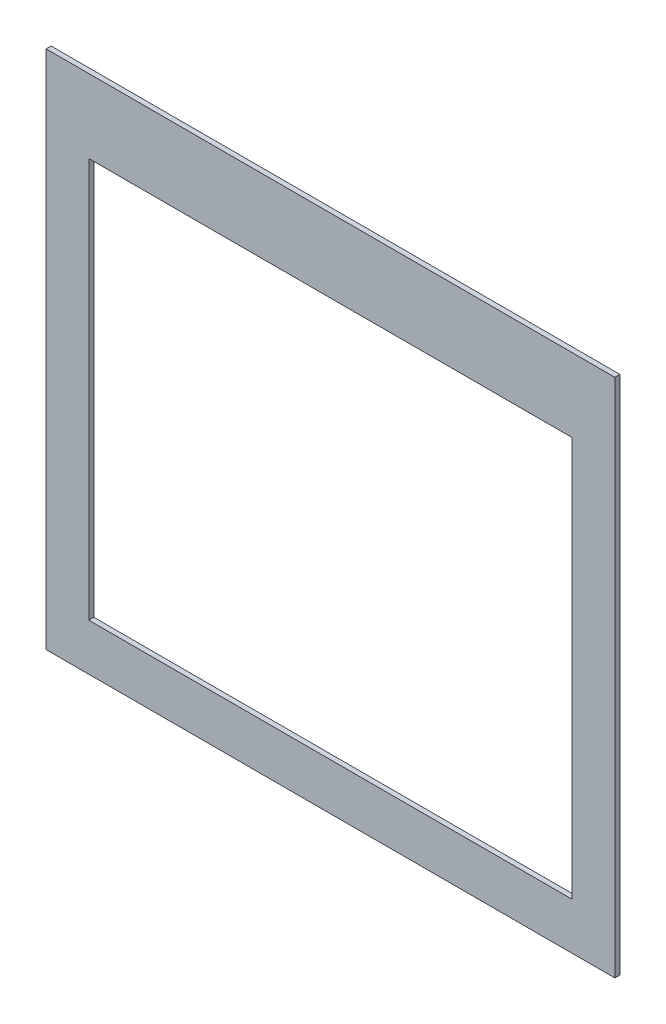
ISO-10303-21;
HEADER;
FILE_DESCRIPTION(('STEP AP214'),'2;1');
FILE_NAME('part.step','',(''),(''),'','','');
FILE_SCHEMA(('AUTOMOTIVE_DESIGN { 1 0 10303 214 1 1 1 1 }'));
ENDSEC;
DATA;
#1=APPLICATION_CONTEXT('core data for automotive mechanical design processes');
#2=APPLICATION_PROTOCOL_DEFINITION('international standard','automotive_design',2000,#1);
#3=PRODUCT_CONTEXT('',#1,'mechanical');
#4=PRODUCT('Part','Part','',(#3));
#5=PRODUCT_RELATED_PRODUCT_CATEGORY('part','',(#4));
#6=PRODUCT_DEFINITION_FORMATION('','',#4);
#7=PRODUCT_DEFINITION_CONTEXT('part definition',#1,'design');
#8=PRODUCT_DEFINITION('design','',#6,#7);
#9=PRODUCT_DEFINITION_SHAPE('','',#8);
#10=(LENGTH_UNIT() NAMED_UNIT(*) SI_UNIT(.MILLI.,.METRE.));
#11=(NAMED_UNIT(*) PLANE_ANGLE_UNIT() SI_UNIT($,.RADIAN.));
#12=(NAMED_UNIT(*) SI_UNIT($,.STERADIAN.) SOLID_ANGLE_UNIT());
#13=UNCERTAINTY_MEASURE_WITH_UNIT(LENGTH_MEASURE(1.E-05),#10,'distance_accuracy_value','');
#14=(GEOMETRIC_REPRESENTATION_CONTEXT(3) GLOBAL_UNCERTAINTY_ASSIGNED_CONTEXT((#13)) GLOBAL_UNIT_ASSIGNED_CONTEXT((#10,
#11,#12)) REPRESENTATION_CONTEXT('',''));
#15=CARTESIAN_POINT('',(0.,0.,0.));
#16=DIRECTION('',(0.,0.,1.));
#17=DIRECTION('',(1.,0.,0.));
#18=AXIS2_PLACEMENT_3D('',#15,#16,#17);
#19=CARTESIAN_POINT('',(0.,0.,3.));
#20=DIRECTION('',(0.,0.,1.));
#21=DIRECTION('',(1.,0.,0.));
#22=AXIS2_PLACEMENT_3D('',#19,#20,#21);
#23=PLANE('',#22);
#24=DIRECTION('',(0.,-1.,0.));
#25=VECTOR('',#24,1.);
#26=CARTESIAN_POINT('',(-170.,-155.5,3.));
#27=LINE('',#26,#25);
#28=CARTESIAN_POINT('',(-170.,155.5,3.));
#29=VERTEX_POINT('',#28);
#30=CARTESIAN_POINT('',(-170.,-155.5,3.));
#31=VERTEX_POINT('',#30);
#32=EDGE_CURVE('E134',#29,#31,#27,.T.);
#33=ORIENTED_EDGE('',*,*,#32,.T.);
#34=DIRECTION('',(1.,0.,0.));
#35=VECTOR('',#34,1.);
#36=CARTESIAN_POINT('',(170.,-155.5,3.));
#37=LINE('',#36,#35);
#38=CARTESIAN_POINT('',(170.,-155.5,3.));
#39=VERTEX_POINT('',#38);
#40=EDGE_CURVE('E137',#31,#39,#37,.T.);
#41=ORIENTED_EDGE('',*,*,#40,.T.);
#42=DIRECTION('',(0.,1.,0.));
#43=VECTOR('',#42,1.);
#44=CARTESIAN_POINT('',(170.,-155.5,3.));
#45=LINE('',#44,#43);
#46=CARTESIAN_POINT('',(170.,155.5,3.));
#47=VERTEX_POINT('',#46);
#48=EDGE_CURVE('E140',#39,#47,#45,.T.);
#49=ORIENTED_EDGE('',*,*,#48,.T.);
#50=DIRECTION('',(-1.,0.,0.));
#51=VECTOR('',#50,1.);
#52=CARTESIAN_POINT('',(170.,155.5,3.));
#53=LINE('',#52,#51);
#54=EDGE_CURVE('E142',#47,#29,#53,.T.);
#55=ORIENTED_EDGE('',*,*,#54,.T.);
#56=EDGE_LOOP('',(#33,#41,#49,#55));
#57=FACE_BOUND('',#56,.T.);
#58=DIRECTION('',(1.,0.,0.));
#59=VECTOR('',#58,1.);
#60=CARTESIAN_POINT('',(144.5,-127.5,3.));
#61=LINE('',#60,#59);
#62=CARTESIAN_POINT('',(-144.5,-127.5,3.));
#63=VERTEX_POINT('',#62);
#64=CARTESIAN_POINT('',(144.5,-127.5,3.));
#65=VERTEX_POINT('',#64);
#66=EDGE_CURVE('E106',#63,#65,#61,.T.);
#67=ORIENTED_EDGE('',*,*,#66,.F.);
#68=DIRECTION('',(0.,-1.,0.));
#69=VECTOR('',#68,1.);
#70=CARTESIAN_POINT('',(-144.5,-127.5,3.));
#71=LINE('',#70,#69);
#72=CARTESIAN_POINT('',(-144.5,111.5,3.));
#73=VERTEX_POINT('',#72);
#74=EDGE_CURVE('E98',#73,#63,#71,.T.);
#75=ORIENTED_EDGE('',*,*,#74,.F.);
#76=DIRECTION('',(-1.,0.,0.));
#77=VECTOR('',#76,1.);
#78=CARTESIAN_POINT('',(144.5,111.5,3.));
#79=LINE('',#78,#77);
#80=CARTESIAN_POINT('',(144.5,111.5,3.));
#81=VERTEX_POINT('',#80);
#82=EDGE_CURVE('E120',#81,#73,#79,.T.);
#83=ORIENTED_EDGE('',*,*,#82,.F.);
#84=DIRECTION('',(0.,1.,0.));
#85=VECTOR('',#84,1.);
#86=CARTESIAN_POINT('',(144.5,-127.5,3.));
#87=LINE('',#86,#85);
#88=EDGE_CURVE('E118',#65,#81,#87,.T.);
#89=ORIENTED_EDGE('',*,*,#88,.F.);
#90=EDGE_LOOP('',(#67,#75,#83,#89));
#91=FACE_BOUND('',#90,.T.);
#92=ADVANCED_FACE('F33',(#57,#91),#23,.T.);
#93=CARTESIAN_POINT('',(0.,0.,0.));
#94=DIRECTION('',(0.,0.,1.));
#95=DIRECTION('',(1.,0.,0.));
#96=AXIS2_PLACEMENT_3D('',#93,#94,#95);
#97=PLANE('',#96);
#98=DIRECTION('',(0.,-1.,0.));
#99=VECTOR('',#98,1.);
#100=CARTESIAN_POINT('',(-170.,-155.5,0.));
#101=LINE('',#100,#99);
#102=CARTESIAN_POINT('',(-170.,155.5,0.));
#103=VERTEX_POINT('',#102);
#104=CARTESIAN_POINT('',(-170.,-155.5,0.));
#105=VERTEX_POINT('',#104);
#106=EDGE_CURVE('E114',#103,#105,#101,.T.);
#107=ORIENTED_EDGE('',*,*,#106,.F.);
#108=DIRECTION('',(-1.,0.,0.));
#109=VECTOR('',#108,1.);
#110=CARTESIAN_POINT('',(170.,155.5,0.));
#111=LINE('',#110,#109);
#112=CARTESIAN_POINT('',(170.,155.5,0.));
#113=VERTEX_POINT('',#112);
#114=EDGE_CURVE('E138',#113,#103,#111,.T.);
#115=ORIENTED_EDGE('',*,*,#114,.F.);
#116=DIRECTION('',(0.,1.,0.));
#117=VECTOR('',#116,1.);
#118=CARTESIAN_POINT('',(170.,-155.5,0.));
#119=LINE('',#118,#117);
#120=CARTESIAN_POINT('',(170.,-155.5,0.));
#121=VERTEX_POINT('',#120);
#122=EDGE_CURVE('E149',#121,#113,#119,.T.);
#123=ORIENTED_EDGE('',*,*,#122,.F.);
#124=DIRECTION('',(1.,0.,0.));
#125=VECTOR('',#124,1.);
#126=CARTESIAN_POINT('',(170.,-155.5,0.));
#127=LINE('',#126,#125);
#128=EDGE_CURVE('E147',#105,#121,#127,.T.);
#129=ORIENTED_EDGE('',*,*,#128,.F.);
#130=EDGE_LOOP('',(#107,#115,#123,#129));
#131=FACE_BOUND('',#130,.T.);
#132=DIRECTION('',(0.,-1.,0.));
#133=VECTOR('',#132,1.);
#134=CARTESIAN_POINT('',(-144.5,-127.5,0.));
#135=LINE('',#134,#133);
#136=CARTESIAN_POINT('',(-144.5,111.5,0.));
#137=VERTEX_POINT('',#136);
#138=CARTESIAN_POINT('',(-144.5,-127.5,0.));
#139=VERTEX_POINT('',#138);
#140=EDGE_CURVE('E56',#137,#139,#135,.T.);
#141=ORIENTED_EDGE('',*,*,#140,.T.);
#142=DIRECTION('',(1.,0.,0.));
#143=VECTOR('',#142,1.);
#144=CARTESIAN_POINT('',(144.5,-127.5,0.));
#145=LINE('',#144,#143);
#146=CARTESIAN_POINT('',(144.5,-127.5,0.));
#147=VERTEX_POINT('',#146);
#148=EDGE_CURVE('E113',#139,#147,#145,.T.);
#149=ORIENTED_EDGE('',*,*,#148,.T.);
#150=DIRECTION('',(0.,1.,0.));
#151=VECTOR('',#150,1.);
#152=CARTESIAN_POINT('',(144.5,-127.5,0.));
#153=LINE('',#152,#151);
#154=CARTESIAN_POINT('',(144.5,111.5,0.));
#155=VERTEX_POINT('',#154);
#156=EDGE_CURVE('E126',#147,#155,#153,.T.);
#157=ORIENTED_EDGE('',*,*,#156,.T.);
#158=DIRECTION('',(-1.,0.,0.));
#159=VECTOR('',#158,1.);
#160=CARTESIAN_POINT('',(144.5,111.5,0.));
#161=LINE('',#160,#159);
#162=EDGE_CURVE('E107',#155,#137,#161,.T.);
#163=ORIENTED_EDGE('',*,*,#162,.T.);
#164=EDGE_LOOP('',(#141,#149,#157,#163));
#165=FACE_BOUND('',#164,.T.);
#166=ADVANCED_FACE('F167',(#131,#165),#97,.F.);
#167=CARTESIAN_POINT('',(-170.,-155.5,3.));
#168=DIRECTION('',(1.,0.,0.));
#169=DIRECTION('',(0.,0.,-1.));
#170=AXIS2_PLACEMENT_3D('',#167,#168,#169);
#171=PLANE('',#170);
#172=ORIENTED_EDGE('',*,*,#106,.T.);
#173=DIRECTION('',(0.,0.,-1.));
#174=VECTOR('',#173,1.);
#175=CARTESIAN_POINT('',(-170.,-155.5,3.));
#176=LINE('',#175,#174);
#177=EDGE_CURVE('E11',#31,#105,#176,.T.);
#178=ORIENTED_EDGE('',*,*,#177,.F.);
#179=ORIENTED_EDGE('',*,*,#32,.F.);
#180=DIRECTION('',(0.,0.,-1.));
#181=VECTOR('',#180,1.);
#182=CARTESIAN_POINT('',(-170.,155.5,3.));
#183=LINE('',#182,#181);
#184=EDGE_CURVE('E144',#29,#103,#183,.T.);
#185=ORIENTED_EDGE('',*,*,#184,.T.);
#186=EDGE_LOOP('',(#172,#178,#179,#185));
#187=FACE_BOUND('',#186,.T.);
#188=ADVANCED_FACE('F35',(#187),#171,.F.);
#189=CARTESIAN_POINT('',(170.,-155.5,3.));
#190=DIRECTION('',(0.,1.,0.));
#191=DIRECTION('',(-1.,0.,0.));
#192=AXIS2_PLACEMENT_3D('',#189,#190,#191);
#193=PLANE('',#192);
#194=ORIENTED_EDGE('',*,*,#128,.T.);
#195=DIRECTION('',(0.,0.,-1.));
#196=VECTOR('',#195,1.);
#197=CARTESIAN_POINT('',(170.,-155.5,3.));
#198=LINE('',#197,#196);
#199=EDGE_CURVE('E41',#39,#121,#198,.T.);
#200=ORIENTED_EDGE('',*,*,#199,.F.);
#201=ORIENTED_EDGE('',*,*,#40,.F.);
#202=ORIENTED_EDGE('',*,*,#177,.T.);
#203=EDGE_LOOP('',(#194,#200,#201,#202));
#204=FACE_BOUND('',#203,.T.);
#205=ADVANCED_FACE('F177',(#204),#193,.F.);
#206=CARTESIAN_POINT('',(170.,-155.5,3.));
#207=DIRECTION('',(-1.,0.,0.));
#208=DIRECTION('',(0.,0.,1.));
#209=AXIS2_PLACEMENT_3D('',#206,#207,#208);
#210=PLANE('',#209);
#211=ORIENTED_EDGE('',*,*,#122,.T.);
#212=DIRECTION('',(0.,0.,-1.));
#213=VECTOR('',#212,1.);
#214=CARTESIAN_POINT('',(170.,155.5,3.));
#215=LINE('',#214,#213);
#216=EDGE_CURVE('E154',#47,#113,#215,.T.);
#217=ORIENTED_EDGE('',*,*,#216,.F.);
#218=ORIENTED_EDGE('',*,*,#48,.F.);
#219=ORIENTED_EDGE('',*,*,#199,.T.);
#220=EDGE_LOOP('',(#211,#217,#218,#219));
#221=FACE_BOUND('',#220,.T.);
#222=ADVANCED_FACE('F161',(#221),#210,.F.);
#223=CARTESIAN_POINT('',(170.,155.5,3.));
#224=DIRECTION('',(0.,-1.,0.));
#225=DIRECTION('',(1.,0.,0.));
#226=AXIS2_PLACEMENT_3D('',#223,#224,#225);
#227=PLANE('',#226);
#228=ORIENTED_EDGE('',*,*,#114,.T.);
#229=ORIENTED_EDGE('',*,*,#184,.F.);
#230=ORIENTED_EDGE('',*,*,#54,.F.);
#231=ORIENTED_EDGE('',*,*,#216,.T.);
#232=EDGE_LOOP('',(#228,#229,#230,#231));
#233=FACE_BOUND('',#232,.T.);
#234=ADVANCED_FACE('F171',(#233),#227,.F.);
#235=CARTESIAN_POINT('',(-144.5,-127.5,3.));
#236=DIRECTION('',(1.,0.,0.));
#237=DIRECTION('',(0.,0.,-1.));
#238=AXIS2_PLACEMENT_3D('',#235,#236,#237);
#239=PLANE('',#238);
#240=ORIENTED_EDGE('',*,*,#140,.F.);
#241=DIRECTION('',(0.,0.,-1.));
#242=VECTOR('',#241,1.);
#243=CARTESIAN_POINT('',(-144.5,111.5,3.));
#244=LINE('',#243,#242);
#245=EDGE_CURVE('E102',#73,#137,#244,.T.);
#246=ORIENTED_EDGE('',*,*,#245,.F.);
#247=ORIENTED_EDGE('',*,*,#74,.T.);
#248=DIRECTION('',(0.,0.,-1.));
#249=VECTOR('',#248,1.);
#250=CARTESIAN_POINT('',(-144.5,-127.5,3.));
#251=LINE('',#250,#249);
#252=EDGE_CURVE('E101',#63,#139,#251,.T.);
#253=ORIENTED_EDGE('',*,*,#252,.T.);
#254=EDGE_LOOP('',(#240,#246,#247,#253));
#255=FACE_BOUND('',#254,.T.);
#256=ADVANCED_FACE('F100',(#255),#239,.T.);
#257=CARTESIAN_POINT('',(144.5,-127.5,3.));
#258=DIRECTION('',(0.,1.,0.));
#259=DIRECTION('',(-1.,0.,0.));
#260=AXIS2_PLACEMENT_3D('',#257,#258,#259);
#261=PLANE('',#260);
#262=ORIENTED_EDGE('',*,*,#148,.F.);
#263=ORIENTED_EDGE('',*,*,#252,.F.);
#264=ORIENTED_EDGE('',*,*,#66,.T.);
#265=DIRECTION('',(0.,0.,-1.));
#266=VECTOR('',#265,1.);
#267=CARTESIAN_POINT('',(144.5,-127.5,3.));
#268=LINE('',#267,#266);
#269=EDGE_CURVE('E115',#65,#147,#268,.T.);
#270=ORIENTED_EDGE('',*,*,#269,.T.);
#271=EDGE_LOOP('',(#262,#263,#264,#270));
#272=FACE_BOUND('',#271,.T.);
#273=ADVANCED_FACE('F110',(#272),#261,.T.);
#274=CARTESIAN_POINT('',(144.5,-127.5,3.));
#275=DIRECTION('',(-1.,0.,0.));
#276=DIRECTION('',(0.,0.,1.));
#277=AXIS2_PLACEMENT_3D('',#274,#275,#276);
#278=PLANE('',#277);
#279=ORIENTED_EDGE('',*,*,#156,.F.);
#280=ORIENTED_EDGE('',*,*,#269,.F.);
#281=ORIENTED_EDGE('',*,*,#88,.T.);
#282=DIRECTION('',(0.,0.,-1.));
#283=VECTOR('',#282,1.);
#284=CARTESIAN_POINT('',(144.5,111.5,3.));
#285=LINE('',#284,#283);
#286=EDGE_CURVE('E48',#81,#155,#285,.T.);
#287=ORIENTED_EDGE('',*,*,#286,.T.);
#288=EDGE_LOOP('',(#279,#280,#281,#287));
#289=FACE_BOUND('',#288,.T.);
#290=ADVANCED_FACE('F200',(#289),#278,.T.);
#291=CARTESIAN_POINT('',(144.5,111.5,3.));
#292=DIRECTION('',(0.,-1.,0.));
#293=DIRECTION('',(1.,0.,0.));
#294=AXIS2_PLACEMENT_3D('',#291,#292,#293);
#295=PLANE('',#294);
#296=ORIENTED_EDGE('',*,*,#162,.F.);
#297=ORIENTED_EDGE('',*,*,#286,.F.);
#298=ORIENTED_EDGE('',*,*,#82,.T.);
#299=ORIENTED_EDGE('',*,*,#245,.T.);
#300=EDGE_LOOP('',(#296,#297,#298,#299));
#301=FACE_BOUND('',#300,.T.);
#302=ADVANCED_FACE('F204',(#301),#295,.T.);
#303=CLOSED_SHELL('',(#92,#166,#188,#205,#222,#234,#256,#273,#290,#302));
#304=MANIFOLD_SOLID_BREP('B2',#303);
#305=ADVANCED_BREP_SHAPE_REPRESENTATION('',(#18,#304),#14);
#306=SHAPE_DEFINITION_REPRESENTATION(#9,#305);
ENDSEC;
END-ISO-10303-21;
